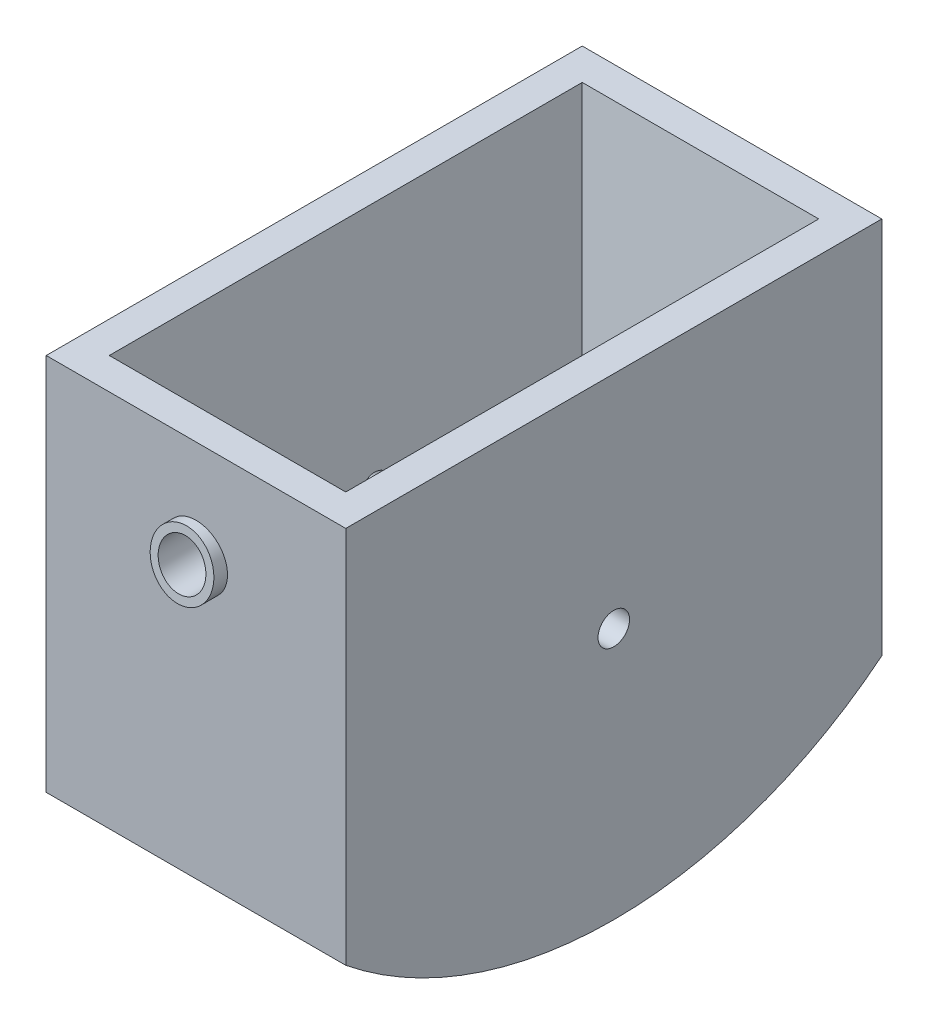
ISO-10303-21;
HEADER;
FILE_DESCRIPTION(('STEP AP214'),'2;1');
FILE_NAME('part.step','',(''),(''),'','','');
FILE_SCHEMA(('AUTOMOTIVE_DESIGN { 1 0 10303 214 1 1 1 1 }'));
ENDSEC;
DATA;
#1=APPLICATION_CONTEXT('core data for automotive mechanical design processes');
#2=APPLICATION_PROTOCOL_DEFINITION('international standard','automotive_design',2000,#1);
#3=PRODUCT_CONTEXT('',#1,'mechanical');
#4=PRODUCT('Part','Part','',(#3));
#5=PRODUCT_RELATED_PRODUCT_CATEGORY('part','',(#4));
#6=PRODUCT_DEFINITION_FORMATION('','',#4);
#7=PRODUCT_DEFINITION_CONTEXT('part definition',#1,'design');
#8=PRODUCT_DEFINITION('design','',#6,#7);
#9=PRODUCT_DEFINITION_SHAPE('','',#8);
#10=(LENGTH_UNIT() NAMED_UNIT(*) SI_UNIT(.MILLI.,.METRE.));
#11=(NAMED_UNIT(*) PLANE_ANGLE_UNIT() SI_UNIT($,.RADIAN.));
#12=(NAMED_UNIT(*) SI_UNIT($,.STERADIAN.) SOLID_ANGLE_UNIT());
#13=UNCERTAINTY_MEASURE_WITH_UNIT(LENGTH_MEASURE(1.E-05),#10,'distance_accuracy_value','');
#14=(GEOMETRIC_REPRESENTATION_CONTEXT(3) GLOBAL_UNCERTAINTY_ASSIGNED_CONTEXT((#13)) GLOBAL_UNIT_ASSIGNED_CONTEXT((#10,
#11,#12)) REPRESENTATION_CONTEXT('',''));
#15=CARTESIAN_POINT('',(0.,0.,0.));
#16=DIRECTION('',(0.,0.,1.));
#17=DIRECTION('',(1.,0.,0.));
#18=AXIS2_PLACEMENT_3D('',#15,#16,#17);
#19=CARTESIAN_POINT('',(-95.,300.,-170.));
#20=DIRECTION('',(0.,0.,1.));
#21=DIRECTION('',(1.,0.,0.));
#22=AXIS2_PLACEMENT_3D('',#19,#20,#21);
#23=PLANE('',#22);
#24=DIRECTION('',(-1.,0.,0.));
#25=VECTOR('',#24,1.);
#26=CARTESIAN_POINT('',(95.,60.,-170.));
#27=LINE('',#26,#25);
#28=CARTESIAN_POINT('',(95.,60.,-170.));
#29=VERTEX_POINT('',#28);
#30=CARTESIAN_POINT('',(-95.,60.,-170.));
#31=VERTEX_POINT('',#30);
#32=EDGE_CURVE('E225',#29,#31,#27,.T.);
#33=ORIENTED_EDGE('',*,*,#32,.T.);
#34=DIRECTION('',(0.,-1.,0.));
#35=VECTOR('',#34,1.);
#36=CARTESIAN_POINT('',(-95.,300.,-170.));
#37=LINE('',#36,#35);
#38=CARTESIAN_POINT('',(-95.,300.,-170.));
#39=VERTEX_POINT('',#38);
#40=EDGE_CURVE('E263',#39,#31,#37,.T.);
#41=ORIENTED_EDGE('',*,*,#40,.F.);
#42=DIRECTION('',(-1.,0.,0.));
#43=VECTOR('',#42,1.);
#44=CARTESIAN_POINT('',(-95.,300.,-170.));
#45=LINE('',#44,#43);
#46=CARTESIAN_POINT('',(95.,300.,-170.));
#47=VERTEX_POINT('',#46);
#48=EDGE_CURVE('E245',#47,#39,#45,.T.);
#49=ORIENTED_EDGE('',*,*,#48,.F.);
#50=DIRECTION('',(0.,-1.,0.));
#51=VECTOR('',#50,1.);
#52=CARTESIAN_POINT('',(95.,300.,-170.));
#53=LINE('',#52,#51);
#54=EDGE_CURVE('E267',#47,#29,#53,.T.);
#55=ORIENTED_EDGE('',*,*,#54,.T.);
#56=EDGE_LOOP('',(#33,#41,#49,#55));
#57=FACE_BOUND('',#56,.T.);
#58=ADVANCED_FACE('F56',(#57),#23,.F.);
#59=CARTESIAN_POINT('',(-95.,160.,0.));
#60=DIRECTION('',(1.,0.,0.));
#61=DIRECTION('',(0.,0.,-1.));
#62=AXIS2_PLACEMENT_3D('',#59,#60,#61);
#63=CYLINDRICAL_SURFACE('',#62,10.);
#64=CARTESIAN_POINT('',(-55.3242831416652,160.,0.));
#65=DIRECTION('',(-0.99026806874157,-0.139173100960065,0.));
#66=DIRECTION('',(0.139173100960065,-0.99026806874157,0.));
#67=AXIS2_PLACEMENT_3D('',#64,#65,#66);
#68=ELLIPSE('',#67,10.0982757251862,10.);
#69=CARTESIAN_POINT('',(-53.9188747946413,150.,0.));
#70=VERTEX_POINT('',#69);
#71=EDGE_CURVE('E187',#70,#70,#68,.T.);
#72=ORIENTED_EDGE('',*,*,#71,.F.);
#73=EDGE_LOOP('',(#72));
#74=FACE_BOUND('',#73,.T.);
#75=CARTESIAN_POINT('',(-95.,160.,0.));
#76=DIRECTION('',(-1.,0.,0.));
#77=DIRECTION('',(0.,0.,1.));
#78=AXIS2_PLACEMENT_3D('',#75,#76,#77);
#79=CIRCLE('',#78,10.);
#80=CARTESIAN_POINT('',(-95.,160.,10.));
#81=VERTEX_POINT('',#80);
#82=EDGE_CURVE('E233',#81,#81,#79,.T.);
#83=ORIENTED_EDGE('',*,*,#82,.T.);
#84=EDGE_LOOP('',(#83));
#85=FACE_BOUND('',#84,.T.);
#86=ADVANCED_FACE('F333',(#74,#85),#63,.F.);
#87=CARTESIAN_POINT('',(-95.,300.,170.));
#88=DIRECTION('',(1.,0.,0.));
#89=DIRECTION('',(0.,0.,-1.));
#90=AXIS2_PLACEMENT_3D('',#87,#88,#89);
#91=PLANE('',#90);
#92=ORIENTED_EDGE('',*,*,#82,.F.);
#93=EDGE_LOOP('',(#92));
#94=FACE_BOUND('',#93,.T.);
#95=DIRECTION('',(0.,0.,-1.));
#96=VECTOR('',#95,1.);
#97=CARTESIAN_POINT('',(-95.,0.,170.));
#98=LINE('',#97,#96);
#99=CARTESIAN_POINT('',(-95.,-6.38822328369315E-10,-0.0011764714901441));
#100=VERTEX_POINT('',#99);
#101=CARTESIAN_POINT('',(-95.,-6.38822328369315E-10,0.00117647149009399));
#102=VERTEX_POINT('',#101);
#103=EDGE_CURVE('E246',#100,#102,#98,.F.);
#104=ORIENTED_EDGE('',*,*,#103,.T.);
#105=CARTESIAN_POINT('',(-95.,270.829999997445,0.00117647149009399));
#106=DIRECTION('',(-1.,0.,0.));
#107=DIRECTION('',(0.,0.,1.));
#108=AXIS2_PLACEMENT_3D('',#105,#106,#107);
#109=CIRCLE('',#108,270.83);
#110=CARTESIAN_POINT('',(-95.,60.,170.));
#111=VERTEX_POINT('',#110);
#112=EDGE_CURVE('E209',#111,#102,#109,.F.);
#113=ORIENTED_EDGE('',*,*,#112,.F.);
#114=DIRECTION('',(0.,-1.,0.));
#115=VECTOR('',#114,1.);
#116=CARTESIAN_POINT('',(-95.,300.,170.));
#117=LINE('',#116,#115);
#118=CARTESIAN_POINT('',(-95.,300.,170.));
#119=VERTEX_POINT('',#118);
#120=EDGE_CURVE('E259',#119,#111,#117,.T.);
#121=ORIENTED_EDGE('',*,*,#120,.F.);
#122=DIRECTION('',(0.,0.,1.));
#123=VECTOR('',#122,1.);
#124=CARTESIAN_POINT('',(-95.,300.,170.));
#125=LINE('',#124,#123);
#126=EDGE_CURVE('E249',#39,#119,#125,.T.);
#127=ORIENTED_EDGE('',*,*,#126,.F.);
#128=ORIENTED_EDGE('',*,*,#40,.T.);
#129=CARTESIAN_POINT('',(-95.,270.829999997445,-0.0011764714901441));
#130=DIRECTION('',(-1.,0.,0.));
#131=DIRECTION('',(0.,0.,1.));
#132=AXIS2_PLACEMENT_3D('',#129,#130,#131);
#133=CIRCLE('',#132,270.83);
#134=EDGE_CURVE('E220',#31,#100,#133,.T.);
#135=ORIENTED_EDGE('',*,*,#134,.T.);
#136=EDGE_LOOP('',(#104,#113,#121,#127,#128,#135));
#137=FACE_BOUND('',#136,.T.);
#138=ADVANCED_FACE('F322',(#94,#137),#91,.F.);
#139=CARTESIAN_POINT('',(0.,237.,227.));
#140=DIRECTION('',(0.,0.,-1.));
#141=DIRECTION('',(-1.,0.,0.));
#142=AXIS2_PLACEMENT_3D('',#139,#140,#141);
#143=CYLINDRICAL_SURFACE('',#142,20.);
#144=CARTESIAN_POINT('',(0.,237.,170.));
#145=DIRECTION('',(0.,0.,-1.));
#146=DIRECTION('',(-1.,0.,0.));
#147=AXIS2_PLACEMENT_3D('',#144,#145,#146);
#148=CIRCLE('',#147,20.);
#149=CARTESIAN_POINT('',(-20.,237.,170.));
#150=VERTEX_POINT('',#149);
#151=EDGE_CURVE('E271',#150,#150,#148,.F.);
#152=ORIENTED_EDGE('',*,*,#151,.T.);
#153=EDGE_LOOP('',(#152));
#154=FACE_BOUND('',#153,.T.);
#155=CARTESIAN_POINT('',(0.,237.,178.854072586251));
#156=DIRECTION('',(0.,-0.139173100960065,-0.99026806874157));
#157=DIRECTION('',(0.,0.99026806874157,-0.139173100960065));
#158=AXIS2_PLACEMENT_3D('',#155,#156,#157);
#159=ELLIPSE('',#158,20.1965514503724,20.);
#160=CARTESIAN_POINT('',(0.,257.,176.043255892203));
#161=VERTEX_POINT('',#160);
#162=EDGE_CURVE('E205',#161,#161,#159,.F.);
#163=ORIENTED_EDGE('',*,*,#162,.F.);
#164=EDGE_LOOP('',(#163));
#165=FACE_BOUND('',#164,.T.);
#166=ADVANCED_FACE('F319',(#154,#165),#143,.T.);
#167=CARTESIAN_POINT('',(-95.,300.,170.));
#168=DIRECTION('',(0.,0.,-1.));
#169=DIRECTION('',(-1.,0.,0.));
#170=AXIS2_PLACEMENT_3D('',#167,#168,#169);
#171=PLANE('',#170);
#172=ORIENTED_EDGE('',*,*,#151,.F.);
#173=EDGE_LOOP('',(#172));
#174=FACE_BOUND('',#173,.T.);
#175=ORIENTED_EDGE('',*,*,#120,.T.);
#176=DIRECTION('',(-1.,0.,0.));
#177=VECTOR('',#176,1.);
#178=CARTESIAN_POINT('',(95.,60.,170.));
#179=LINE('',#178,#177);
#180=CARTESIAN_POINT('',(95.,60.,170.));
#181=VERTEX_POINT('',#180);
#182=EDGE_CURVE('E214',#181,#111,#179,.T.);
#183=ORIENTED_EDGE('',*,*,#182,.F.);
#184=DIRECTION('',(0.,-1.,0.));
#185=VECTOR('',#184,1.);
#186=CARTESIAN_POINT('',(95.,300.,170.));
#187=LINE('',#186,#185);
#188=CARTESIAN_POINT('',(95.,300.,170.));
#189=VERTEX_POINT('',#188);
#190=EDGE_CURVE('E255',#189,#181,#187,.T.);
#191=ORIENTED_EDGE('',*,*,#190,.F.);
#192=DIRECTION('',(1.,0.,0.));
#193=VECTOR('',#192,1.);
#194=CARTESIAN_POINT('',(-95.,300.,170.));
#195=LINE('',#194,#193);
#196=EDGE_CURVE('E252',#119,#189,#195,.T.);
#197=ORIENTED_EDGE('',*,*,#196,.F.);
#198=EDGE_LOOP('',(#175,#183,#191,#197));
#199=FACE_BOUND('',#198,.T.);
#200=ADVANCED_FACE('F321',(#174,#199),#171,.F.);
#201=CARTESIAN_POINT('',(0.,300.,0.));
#202=DIRECTION('',(0.,-1.,0.));
#203=DIRECTION('',(0.,0.,-1.));
#204=AXIS2_PLACEMENT_3D('',#201,#202,#203);
#205=PLANE('',#204);
#206=DIRECTION('',(0.,0.,1.));
#207=VECTOR('',#206,1.);
#208=CARTESIAN_POINT('',(-75.,300.,-150.));
#209=LINE('',#208,#207);
#210=CARTESIAN_POINT('',(-75.,300.,-150.));
#211=VERTEX_POINT('',#210);
#212=CARTESIAN_POINT('',(-75.,300.,150.));
#213=VERTEX_POINT('',#212);
#214=EDGE_CURVE('E159',#211,#213,#209,.T.);
#215=ORIENTED_EDGE('',*,*,#214,.F.);
#216=DIRECTION('',(-1.,0.,0.));
#217=VECTOR('',#216,1.);
#218=CARTESIAN_POINT('',(-75.,300.,-150.));
#219=LINE('',#218,#217);
#220=CARTESIAN_POINT('',(75.,300.,-150.));
#221=VERTEX_POINT('',#220);
#222=EDGE_CURVE('E73',#221,#211,#219,.T.);
#223=ORIENTED_EDGE('',*,*,#222,.F.);
#224=DIRECTION('',(0.,0.,-1.));
#225=VECTOR('',#224,1.);
#226=CARTESIAN_POINT('',(75.,300.,-150.));
#227=LINE('',#226,#225);
#228=CARTESIAN_POINT('',(75.,300.,150.));
#229=VERTEX_POINT('',#228);
#230=EDGE_CURVE('E167',#229,#221,#227,.T.);
#231=ORIENTED_EDGE('',*,*,#230,.F.);
#232=DIRECTION('',(1.,0.,0.));
#233=VECTOR('',#232,1.);
#234=CARTESIAN_POINT('',(-75.,300.,150.));
#235=LINE('',#234,#233);
#236=EDGE_CURVE('E149',#213,#229,#235,.T.);
#237=ORIENTED_EDGE('',*,*,#236,.F.);
#238=EDGE_LOOP('',(#215,#223,#231,#237));
#239=FACE_BOUND('',#238,.T.);
#240=DIRECTION('',(0.,0.,-1.));
#241=VECTOR('',#240,1.);
#242=CARTESIAN_POINT('',(95.,300.,170.));
#243=LINE('',#242,#241);
#244=EDGE_CURVE('E241',#189,#47,#243,.T.);
#245=ORIENTED_EDGE('',*,*,#244,.T.);
#246=ORIENTED_EDGE('',*,*,#48,.T.);
#247=ORIENTED_EDGE('',*,*,#126,.T.);
#248=ORIENTED_EDGE('',*,*,#196,.T.);
#249=EDGE_LOOP('',(#245,#246,#247,#248));
#250=FACE_BOUND('',#249,.T.);
#251=ADVANCED_FACE('F164',(#239,#250),#205,.F.);
#252=CARTESIAN_POINT('',(55.3242831416652,160.,0.));
#253=DIRECTION('',(0.99026806874157,-0.139173100960065,0.));
#254=DIRECTION('',(0.139173100960065,0.99026806874157,0.));
#255=AXIS2_PLACEMENT_3D('',#252,#253,#254);
#256=ELLIPSE('',#255,10.0982757251862,10.);
#257=CARTESIAN_POINT('',(56.7296914886891,170.,0.));
#258=VERTEX_POINT('',#257);
#259=EDGE_CURVE('E201',#258,#258,#256,.T.);
#260=ORIENTED_EDGE('',*,*,#259,.F.);
#261=EDGE_LOOP('',(#260));
#262=FACE_BOUND('',#261,.T.);
#263=CARTESIAN_POINT('',(95.,160.,0.));
#264=DIRECTION('',(-1.,0.,0.));
#265=DIRECTION('',(0.,0.,1.));
#266=AXIS2_PLACEMENT_3D('',#263,#264,#265);
#267=CIRCLE('',#266,10.);
#268=CARTESIAN_POINT('',(95.,160.,10.));
#269=VERTEX_POINT('',#268);
#270=EDGE_CURVE('E232',#269,#269,#267,.T.);
#271=ORIENTED_EDGE('',*,*,#270,.F.);
#272=EDGE_LOOP('',(#271));
#273=FACE_BOUND('',#272,.T.);
#274=ADVANCED_FACE('F345',(#262,#273),#63,.F.);
#275=CARTESIAN_POINT('',(95.,300.,170.));
#276=DIRECTION('',(-1.,0.,0.));
#277=DIRECTION('',(0.,0.,1.));
#278=AXIS2_PLACEMENT_3D('',#275,#276,#277);
#279=PLANE('',#278);
#280=ORIENTED_EDGE('',*,*,#270,.T.);
#281=EDGE_LOOP('',(#280));
#282=FACE_BOUND('',#281,.T.);
#283=ORIENTED_EDGE('',*,*,#190,.T.);
#284=CARTESIAN_POINT('',(95.,270.829999997445,0.00117647149009399));
#285=DIRECTION('',(-1.,0.,0.));
#286=DIRECTION('',(0.,0.,1.));
#287=AXIS2_PLACEMENT_3D('',#284,#285,#286);
#288=CIRCLE('',#287,270.83);
#289=CARTESIAN_POINT('',(95.,-6.38822328369315E-10,0.00117647149009399));
#290=VERTEX_POINT('',#289);
#291=EDGE_CURVE('E210',#181,#290,#288,.F.);
#292=ORIENTED_EDGE('',*,*,#291,.T.);
#293=DIRECTION('',(0.,0.,1.));
#294=VECTOR('',#293,1.);
#295=CARTESIAN_POINT('',(95.,0.,170.));
#296=LINE('',#295,#294);
#297=CARTESIAN_POINT('',(95.,-6.38822328369315E-10,-0.0011764714901441));
#298=VERTEX_POINT('',#297);
#299=EDGE_CURVE('E237',#290,#298,#296,.F.);
#300=ORIENTED_EDGE('',*,*,#299,.T.);
#301=CARTESIAN_POINT('',(95.,270.829999997445,-0.0011764714901441));
#302=DIRECTION('',(-1.,0.,0.));
#303=DIRECTION('',(0.,0.,1.));
#304=AXIS2_PLACEMENT_3D('',#301,#302,#303);
#305=CIRCLE('',#304,270.83);
#306=EDGE_CURVE('E221',#29,#298,#305,.T.);
#307=ORIENTED_EDGE('',*,*,#306,.F.);
#308=ORIENTED_EDGE('',*,*,#54,.F.);
#309=ORIENTED_EDGE('',*,*,#244,.F.);
#310=EDGE_LOOP('',(#283,#292,#300,#307,#308,#309));
#311=FACE_BOUND('',#310,.T.);
#312=ADVANCED_FACE('F58',(#282,#311),#279,.F.);
#313=CARTESIAN_POINT('',(95.,270.829999997445,-0.0011764714901441));
#314=DIRECTION('',(-1.,0.,0.));
#315=DIRECTION('',(0.,0.,1.));
#316=AXIS2_PLACEMENT_3D('',#313,#314,#315);
#317=CYLINDRICAL_SURFACE('',#316,270.83);
#318=CARTESIAN_POINT('',(70.9004238513721,270.829999997445,-0.0011764714901441));
#319=DIRECTION('',(0.99026806874157,-0.139173100960065,0.));
#320=DIRECTION('',(-0.139173100960065,-0.99026806874157,0.));
#321=AXIS2_PLACEMENT_3D('',#318,#319,#320);
#322=ELLIPSE('',#321,273.491601465217,270.83);
#323=CARTESIAN_POINT('',(36.1936300614296,23.8783303034557,-111.19363006143));
#324=VERTEX_POINT('',#323);
#325=CARTESIAN_POINT('',(32.8377495892826,0.,-0.0011764714901441));
#326=VERTEX_POINT('',#325);
#327=EDGE_CURVE('E198',#324,#326,#322,.F.);
#328=ORIENTED_EDGE('',*,*,#327,.F.);
#329=DIRECTION('',(-1.,0.,0.));
#330=VECTOR('',#329,1.);
#331=CARTESIAN_POINT('',(95.,23.8783303034555,-111.19363006143));
#332=LINE('',#331,#330);
#333=CARTESIAN_POINT('',(-36.1936300614296,23.8783303034557,-111.19363006143));
#334=VERTEX_POINT('',#333);
#335=EDGE_CURVE('E13',#334,#324,#332,.F.);
#336=ORIENTED_EDGE('',*,*,#335,.F.);
#337=CARTESIAN_POINT('',(-70.9004238513721,270.829999997445,-0.0011764714901441));
#338=DIRECTION('',(-0.99026806874157,-0.139173100960065,0.));
#339=DIRECTION('',(-0.139173100960065,0.99026806874157,0.));
#340=AXIS2_PLACEMENT_3D('',#337,#338,#339);
#341=ELLIPSE('',#340,273.491601465217,270.83);
#342=CARTESIAN_POINT('',(-32.8377495892826,0.,-0.0011764714901441));
#343=VERTEX_POINT('',#342);
#344=EDGE_CURVE('E184',#343,#334,#341,.F.);
#345=ORIENTED_EDGE('',*,*,#344,.F.);
#346=DIRECTION('',(-1.,0.,0.));
#347=VECTOR('',#346,1.);
#348=CARTESIAN_POINT('',(95.,-1.27764465673863E-09,-0.0011764714901441));
#349=LINE('',#348,#347);
#350=EDGE_CURVE('E275',#343,#100,#349,.T.);
#351=ORIENTED_EDGE('',*,*,#350,.T.);
#352=ORIENTED_EDGE('',*,*,#134,.F.);
#353=ORIENTED_EDGE('',*,*,#32,.F.);
#354=ORIENTED_EDGE('',*,*,#306,.T.);
#355=EDGE_CURVE('E276',#298,#326,#349,.T.);
#356=ORIENTED_EDGE('',*,*,#355,.T.);
#357=EDGE_LOOP('',(#328,#336,#345,#351,#352,#353,#354,#356));
#358=FACE_BOUND('',#357,.T.);
#359=ADVANCED_FACE('F357',(#358),#317,.T.);
#360=CARTESIAN_POINT('',(95.,270.829999997445,0.00117647149009399));
#361=DIRECTION('',(-1.,0.,0.));
#362=DIRECTION('',(0.,0.,1.));
#363=AXIS2_PLACEMENT_3D('',#360,#361,#362);
#364=CYLINDRICAL_SURFACE('',#363,270.83);
#365=DIRECTION('',(-1.,0.,0.));
#366=VECTOR('',#365,1.);
#367=CARTESIAN_POINT('',(95.,23.8783303034556,111.19363006143));
#368=LINE('',#367,#366);
#369=CARTESIAN_POINT('',(-36.1936300614296,23.8783303034556,111.19363006143));
#370=VERTEX_POINT('',#369);
#371=CARTESIAN_POINT('',(36.1936300614296,23.8783303034556,111.19363006143));
#372=VERTEX_POINT('',#371);
#373=EDGE_CURVE('E152',#370,#372,#368,.F.);
#374=ORIENTED_EDGE('',*,*,#373,.T.);
#375=CARTESIAN_POINT('',(70.9004238513721,270.829999997445,0.00117647149009399));
#376=DIRECTION('',(0.99026806874157,-0.139173100960065,0.));
#377=DIRECTION('',(-0.139173100960065,-0.99026806874157,0.));
#378=AXIS2_PLACEMENT_3D('',#375,#376,#377);
#379=ELLIPSE('',#378,273.491601465217,270.83);
#380=CARTESIAN_POINT('',(32.837749589103,-1.27764465673863E-09,0.00117647149009399));
#381=VERTEX_POINT('',#380);
#382=EDGE_CURVE('E66',#372,#381,#379,.T.);
#383=ORIENTED_EDGE('',*,*,#382,.T.);
#384=DIRECTION('',(-1.,0.,0.));
#385=VECTOR('',#384,1.);
#386=CARTESIAN_POINT('',(95.,-1.27764465673863E-09,0.00117647149009399));
#387=LINE('',#386,#385);
#388=EDGE_CURVE('E280',#381,#290,#387,.F.);
#389=ORIENTED_EDGE('',*,*,#388,.T.);
#390=ORIENTED_EDGE('',*,*,#291,.F.);
#391=ORIENTED_EDGE('',*,*,#182,.T.);
#392=ORIENTED_EDGE('',*,*,#112,.T.);
#393=CARTESIAN_POINT('',(-32.837749589103,-1.27764465673863E-09,0.00117647149009399));
#394=VERTEX_POINT('',#393);
#395=EDGE_CURVE('E283',#102,#394,#387,.F.);
#396=ORIENTED_EDGE('',*,*,#395,.T.);
#397=CARTESIAN_POINT('',(-70.9004238513721,270.829999997445,0.00117647149009399));
#398=DIRECTION('',(-0.99026806874157,-0.139173100960065,0.));
#399=DIRECTION('',(-0.139173100960065,0.99026806874157,0.));
#400=AXIS2_PLACEMENT_3D('',#397,#398,#399);
#401=ELLIPSE('',#400,273.491601465217,270.83);
#402=EDGE_CURVE('E287',#394,#370,#401,.T.);
#403=ORIENTED_EDGE('',*,*,#402,.T.);
#404=EDGE_LOOP('',(#374,#383,#389,#390,#391,#392,#396,#403));
#405=FACE_BOUND('',#404,.T.);
#406=ADVANCED_FACE('F298',(#405),#364,.T.);
#407=CARTESIAN_POINT('',(0.,0.,0.));
#408=DIRECTION('',(0.,-1.,0.));
#409=DIRECTION('',(0.,0.,-1.));
#410=AXIS2_PLACEMENT_3D('',#407,#408,#409);
#411=PLANE('',#410);
#412=DIRECTION('',(0.,0.,-1.));
#413=VECTOR('',#412,1.);
#414=CARTESIAN_POINT('',(-32.8377495892826,0.,0.));
#415=LINE('',#414,#413);
#416=EDGE_CURVE('E177',#394,#343,#415,.T.);
#417=ORIENTED_EDGE('',*,*,#416,.F.);
#418=ORIENTED_EDGE('',*,*,#395,.F.);
#419=ORIENTED_EDGE('',*,*,#103,.F.);
#420=ORIENTED_EDGE('',*,*,#350,.F.);
#421=EDGE_LOOP('',(#417,#418,#419,#420));
#422=FACE_BOUND('',#421,.T.);
#423=ADVANCED_FACE('F347',(#422),#411,.T.);
#424=DIRECTION('',(0.,0.,1.));
#425=VECTOR('',#424,1.);
#426=CARTESIAN_POINT('',(32.8377495892826,0.,0.));
#427=LINE('',#426,#425);
#428=EDGE_CURVE('E195',#326,#381,#427,.T.);
#429=ORIENTED_EDGE('',*,*,#428,.F.);
#430=ORIENTED_EDGE('',*,*,#355,.F.);
#431=ORIENTED_EDGE('',*,*,#299,.F.);
#432=ORIENTED_EDGE('',*,*,#388,.F.);
#433=EDGE_LOOP('',(#429,#430,#431,#432));
#434=FACE_BOUND('',#433,.T.);
#435=ADVANCED_FACE('F303',(#434),#411,.T.);
#436=CARTESIAN_POINT('',(-75.,300.,150.));
#437=DIRECTION('',(0.,-0.139173100960065,0.99026806874157));
#438=DIRECTION('',(0.,-0.99026806874157,-0.139173100960065));
#439=AXIS2_PLACEMENT_3D('',#436,#437,#438);
#440=PLANE('',#439);
#441=CARTESIAN_POINT('',(0.,237.,141.145927413749));
#442=DIRECTION('',(0.,-0.139173100960065,0.99026806874157));
#443=DIRECTION('',(0.,-0.99026806874157,-0.139173100960065));
#444=AXIS2_PLACEMENT_3D('',#441,#442,#443);
#445=ELLIPSE('',#444,15.1474135877793,15.);
#446=CARTESIAN_POINT('',(0.,222.,139.037814893214));
#447=VERTEX_POINT('',#446);
#448=EDGE_CURVE('E191',#447,#447,#445,.T.);
#449=ORIENTED_EDGE('',*,*,#448,.T.);
#450=EDGE_LOOP('',(#449));
#451=FACE_BOUND('',#450,.T.);
#452=DIRECTION('',(-0.137844537491629,0.980814848463989,0.137844537491629));
#453=VECTOR('',#452,1.);
#454=CARTESIAN_POINT('',(-69.2996650451157,259.440009254568,144.299665045116));
#455=LINE('',#454,#453);
#456=EDGE_CURVE('E81',#370,#213,#455,.T.);
#457=ORIENTED_EDGE('',*,*,#456,.T.);
#458=ORIENTED_EDGE('',*,*,#236,.T.);
#459=DIRECTION('',(0.137844537491629,0.980814848463989,0.137844537491629));
#460=VECTOR('',#459,1.);
#461=CARTESIAN_POINT('',(72.1498325225578,279.720004627284,147.149832522558));
#462=LINE('',#461,#460);
#463=EDGE_CURVE('E155',#372,#229,#462,.T.);
#464=ORIENTED_EDGE('',*,*,#463,.F.);
#465=ORIENTED_EDGE('',*,*,#373,.F.);
#466=EDGE_LOOP('',(#457,#458,#464,#465));
#467=FACE_BOUND('',#466,.T.);
#468=ADVANCED_FACE('F146',(#451,#467),#440,.F.);
#469=CARTESIAN_POINT('',(-75.,300.,-150.));
#470=DIRECTION('',(0.,-0.139173100960065,-0.99026806874157));
#471=DIRECTION('',(0.,0.99026806874157,-0.139173100960065));
#472=AXIS2_PLACEMENT_3D('',#469,#470,#471);
#473=PLANE('',#472);
#474=ORIENTED_EDGE('',*,*,#335,.T.);
#475=DIRECTION('',(0.137844537491629,0.980814848463989,-0.137844537491629));
#476=VECTOR('',#475,1.);
#477=CARTESIAN_POINT('',(75.,300.,-150.));
#478=LINE('',#477,#476);
#479=EDGE_CURVE('E174',#324,#221,#478,.T.);
#480=ORIENTED_EDGE('',*,*,#479,.T.);
#481=ORIENTED_EDGE('',*,*,#222,.T.);
#482=DIRECTION('',(-0.137844537491629,0.980814848463989,-0.137844537491629));
#483=VECTOR('',#482,1.);
#484=CARTESIAN_POINT('',(-75.,300.,-150.));
#485=LINE('',#484,#483);
#486=EDGE_CURVE('E156',#334,#211,#485,.T.);
#487=ORIENTED_EDGE('',*,*,#486,.F.);
#488=EDGE_LOOP('',(#474,#480,#481,#487));
#489=FACE_BOUND('',#488,.T.);
#490=ADVANCED_FACE('F374',(#489),#473,.F.);
#491=CARTESIAN_POINT('',(75.,300.,-150.));
#492=DIRECTION('',(0.99026806874157,-0.139173100960065,0.));
#493=DIRECTION('',(0.139173100960065,0.99026806874157,0.));
#494=AXIS2_PLACEMENT_3D('',#491,#492,#493);
#495=PLANE('',#494);
#496=ORIENTED_EDGE('',*,*,#259,.T.);
#497=EDGE_LOOP('',(#496));
#498=FACE_BOUND('',#497,.T.);
#499=ORIENTED_EDGE('',*,*,#327,.T.);
#500=ORIENTED_EDGE('',*,*,#428,.T.);
#501=ORIENTED_EDGE('',*,*,#382,.F.);
#502=ORIENTED_EDGE('',*,*,#463,.T.);
#503=ORIENTED_EDGE('',*,*,#230,.T.);
#504=ORIENTED_EDGE('',*,*,#479,.F.);
#505=EDGE_LOOP('',(#499,#500,#501,#502,#503,#504));
#506=FACE_BOUND('',#505,.T.);
#507=ADVANCED_FACE('F368',(#498,#506),#495,.F.);
#508=CARTESIAN_POINT('',(-75.,300.,-150.));
#509=DIRECTION('',(-0.99026806874157,-0.139173100960065,0.));
#510=DIRECTION('',(0.139173100960065,-0.99026806874157,0.));
#511=AXIS2_PLACEMENT_3D('',#508,#509,#510);
#512=PLANE('',#511);
#513=ORIENTED_EDGE('',*,*,#71,.T.);
#514=EDGE_LOOP('',(#513));
#515=FACE_BOUND('',#514,.T.);
#516=ORIENTED_EDGE('',*,*,#344,.T.);
#517=ORIENTED_EDGE('',*,*,#486,.T.);
#518=ORIENTED_EDGE('',*,*,#214,.T.);
#519=ORIENTED_EDGE('',*,*,#456,.F.);
#520=ORIENTED_EDGE('',*,*,#402,.F.);
#521=ORIENTED_EDGE('',*,*,#416,.T.);
#522=EDGE_LOOP('',(#516,#517,#518,#519,#520,#521));
#523=FACE_BOUND('',#522,.T.);
#524=ADVANCED_FACE('F160',(#515,#523),#512,.F.);
#525=CARTESIAN_POINT('',(0.,237.,227.));
#526=DIRECTION('',(0.,0.,-1.));
#527=DIRECTION('',(-1.,0.,0.));
#528=AXIS2_PLACEMENT_3D('',#525,#526,#527);
#529=CYLINDRICAL_SURFACE('',#528,15.);
#530=ORIENTED_EDGE('',*,*,#448,.F.);
#531=EDGE_LOOP('',(#530));
#532=FACE_BOUND('',#531,.T.);
#533=CARTESIAN_POINT('',(0.,237.,178.854072586251));
#534=DIRECTION('',(0.,-0.139173100960065,-0.99026806874157));
#535=DIRECTION('',(0.,0.99026806874157,-0.139173100960065));
#536=AXIS2_PLACEMENT_3D('',#533,#534,#535);
#537=ELLIPSE('',#536,15.1474135877793,15.);
#538=CARTESIAN_POINT('',(0.,252.,176.745960065715));
#539=VERTEX_POINT('',#538);
#540=EDGE_CURVE('E60',#539,#539,#537,.F.);
#541=ORIENTED_EDGE('',*,*,#540,.T.);
#542=EDGE_LOOP('',(#541));
#543=FACE_BOUND('',#542,.T.);
#544=ADVANCED_FACE('F311',(#532,#543),#529,.F.);
#545=CARTESIAN_POINT('',(-95.,300.,170.));
#546=DIRECTION('',(0.,-0.139173100960065,-0.99026806874157));
#547=DIRECTION('',(0.,0.99026806874157,-0.139173100960065));
#548=AXIS2_PLACEMENT_3D('',#545,#546,#547);
#549=PLANE('',#548);
#550=ORIENTED_EDGE('',*,*,#540,.F.);
#551=EDGE_LOOP('',(#550));
#552=FACE_BOUND('',#551,.T.);
#553=ORIENTED_EDGE('',*,*,#162,.T.);
#554=EDGE_LOOP('',(#553));
#555=FACE_BOUND('',#554,.T.);
#556=ADVANCED_FACE('F313',(#552,#555),#549,.F.);
#557=CLOSED_SHELL('',(#58,#86,#138,#166,#200,#251,#274,#312,#359,#406,#423,#435,#468,#490,#507,
#524,#544,#556));
#558=MANIFOLD_SOLID_BREP('B2',#557);
#559=ADVANCED_BREP_SHAPE_REPRESENTATION('',(#18,#558),#14);
#560=SHAPE_DEFINITION_REPRESENTATION(#9,#559);
ENDSEC;
END-ISO-10303-21;
